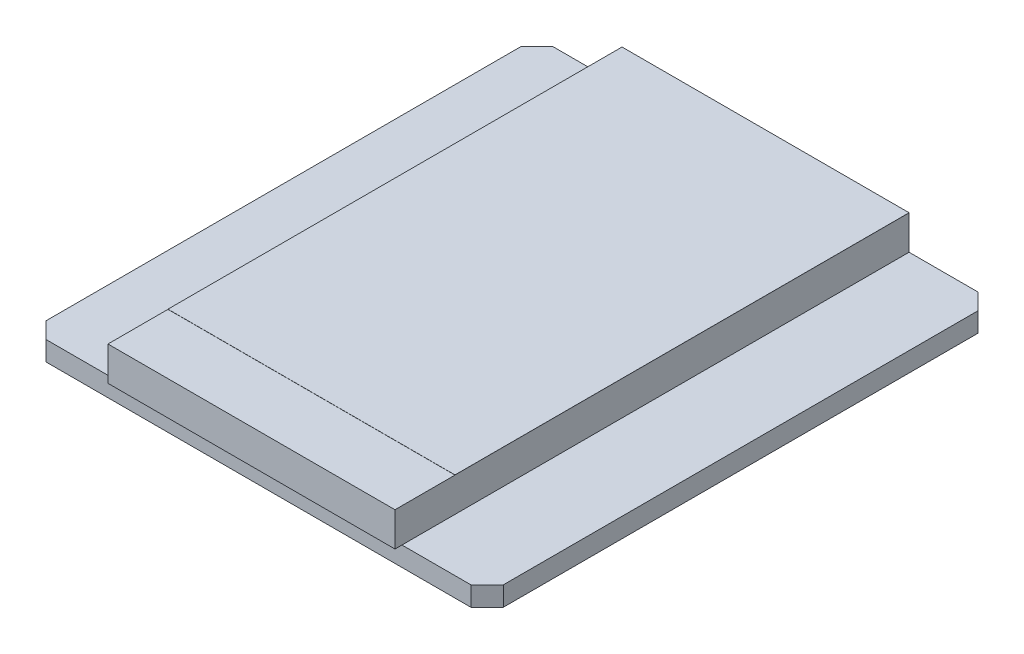
ISO-10303-21;
HEADER;
FILE_DESCRIPTION(('STEP AP214'),'2;1');
FILE_NAME('part.step','',(''),(''),'','','');
FILE_SCHEMA(('AUTOMOTIVE_DESIGN { 1 0 10303 214 1 1 1 1 }'));
ENDSEC;
DATA;
#1=APPLICATION_CONTEXT('core data for automotive mechanical design processes');
#2=APPLICATION_PROTOCOL_DEFINITION('international standard','automotive_design',2000,#1);
#3=PRODUCT_CONTEXT('',#1,'mechanical');
#4=PRODUCT('Part','Part','',(#3));
#5=PRODUCT_RELATED_PRODUCT_CATEGORY('part','',(#4));
#6=PRODUCT_DEFINITION_FORMATION('','',#4);
#7=PRODUCT_DEFINITION_CONTEXT('part definition',#1,'design');
#8=PRODUCT_DEFINITION('design','',#6,#7);
#9=PRODUCT_DEFINITION_SHAPE('','',#8);
#10=(LENGTH_UNIT() NAMED_UNIT(*) SI_UNIT(.MILLI.,.METRE.));
#11=(NAMED_UNIT(*) PLANE_ANGLE_UNIT() SI_UNIT($,.RADIAN.));
#12=(NAMED_UNIT(*) SI_UNIT($,.STERADIAN.) SOLID_ANGLE_UNIT());
#13=UNCERTAINTY_MEASURE_WITH_UNIT(LENGTH_MEASURE(1.E-05),#10,'distance_accuracy_value','');
#14=(GEOMETRIC_REPRESENTATION_CONTEXT(3) GLOBAL_UNCERTAINTY_ASSIGNED_CONTEXT((#13)) GLOBAL_UNIT_ASSIGNED_CONTEXT((#10,
#11,#12)) REPRESENTATION_CONTEXT('',''));
#15=CARTESIAN_POINT('',(0.,0.,0.));
#16=DIRECTION('',(0.,0.,1.));
#17=DIRECTION('',(1.,0.,0.));
#18=AXIS2_PLACEMENT_3D('',#15,#16,#17);
#19=CARTESIAN_POINT('',(-8.85,3.31,-15.635));
#20=DIRECTION('',(1.,0.,0.));
#21=DIRECTION('',(0.,0.,-1.));
#22=AXIS2_PLACEMENT_3D('',#19,#20,#21);
#23=PLANE('',#22);
#24=DIRECTION('',(0.,0.,1.));
#25=VECTOR('',#24,1.);
#26=CARTESIAN_POINT('',(-8.85,3.3,-15.635));
#27=LINE('',#26,#25);
#28=CARTESIAN_POINT('',(-8.85,3.3,-15.635));
#29=VERTEX_POINT('',#28);
#30=CARTESIAN_POINT('',(-8.85,3.3,12.365));
#31=VERTEX_POINT('',#30);
#32=EDGE_CURVE('E120',#29,#31,#27,.T.);
#33=ORIENTED_EDGE('',*,*,#32,.T.);
#34=DIRECTION('',(0.,-1.,0.));
#35=VECTOR('',#34,1.);
#36=CARTESIAN_POINT('',(-8.85,3.31,12.365));
#37=LINE('',#36,#35);
#38=CARTESIAN_POINT('',(-8.85,3.31,12.365));
#39=VERTEX_POINT('',#38);
#40=EDGE_CURVE('E12',#39,#31,#37,.T.);
#41=ORIENTED_EDGE('',*,*,#40,.F.);
#42=DIRECTION('',(0.,0.,1.));
#43=VECTOR('',#42,1.);
#44=CARTESIAN_POINT('',(-8.85,3.31,-15.635));
#45=LINE('',#44,#43);
#46=CARTESIAN_POINT('',(-8.85,3.31,-15.635));
#47=VERTEX_POINT('',#46);
#48=EDGE_CURVE('E104',#47,#39,#45,.T.);
#49=ORIENTED_EDGE('',*,*,#48,.F.);
#50=DIRECTION('',(0.,-1.,0.));
#51=VECTOR('',#50,1.);
#52=CARTESIAN_POINT('',(-8.85,3.31,-15.635));
#53=LINE('',#52,#51);
#54=EDGE_CURVE('E114',#47,#29,#53,.T.);
#55=ORIENTED_EDGE('',*,*,#54,.T.);
#56=EDGE_LOOP('',(#33,#41,#49,#55));
#57=FACE_BOUND('',#56,.T.);
#58=ADVANCED_FACE('F53',(#57),#23,.F.);
#59=CARTESIAN_POINT('',(-8.85,3.31,12.365));
#60=DIRECTION('',(0.,0.,-1.));
#61=DIRECTION('',(-1.,0.,0.));
#62=AXIS2_PLACEMENT_3D('',#59,#60,#61);
#63=PLANE('',#62);
#64=DIRECTION('',(1.,0.,0.));
#65=VECTOR('',#64,1.);
#66=CARTESIAN_POINT('',(-8.85,3.3,12.365));
#67=LINE('',#66,#65);
#68=CARTESIAN_POINT('',(8.85,3.3,12.365));
#69=VERTEX_POINT('',#68);
#70=EDGE_CURVE('E108',#31,#69,#67,.T.);
#71=ORIENTED_EDGE('',*,*,#70,.T.);
#72=DIRECTION('',(0.,-1.,0.));
#73=VECTOR('',#72,1.);
#74=CARTESIAN_POINT('',(8.85,3.31,12.365));
#75=LINE('',#74,#73);
#76=CARTESIAN_POINT('',(8.85,3.31,12.365));
#77=VERTEX_POINT('',#76);
#78=EDGE_CURVE('E65',#77,#69,#75,.T.);
#79=ORIENTED_EDGE('',*,*,#78,.F.);
#80=DIRECTION('',(1.,0.,0.));
#81=VECTOR('',#80,1.);
#82=CARTESIAN_POINT('',(-8.85,3.31,12.365));
#83=LINE('',#82,#81);
#84=EDGE_CURVE('E99',#39,#77,#83,.T.);
#85=ORIENTED_EDGE('',*,*,#84,.F.);
#86=ORIENTED_EDGE('',*,*,#40,.T.);
#87=EDGE_LOOP('',(#71,#79,#85,#86));
#88=FACE_BOUND('',#87,.T.);
#89=ADVANCED_FACE('F107',(#88),#63,.F.);
#90=CARTESIAN_POINT('',(8.85,3.31,-15.635));
#91=DIRECTION('',(-1.,0.,0.));
#92=DIRECTION('',(0.,0.,1.));
#93=AXIS2_PLACEMENT_3D('',#90,#91,#92);
#94=PLANE('',#93);
#95=DIRECTION('',(0.,0.,-1.));
#96=VECTOR('',#95,1.);
#97=CARTESIAN_POINT('',(8.85,3.3,-15.635));
#98=LINE('',#97,#96);
#99=CARTESIAN_POINT('',(8.85,3.3,-15.635));
#100=VERTEX_POINT('',#99);
#101=EDGE_CURVE('E87',#69,#100,#98,.T.);
#102=ORIENTED_EDGE('',*,*,#101,.T.);
#103=DIRECTION('',(0.,-1.,0.));
#104=VECTOR('',#103,1.);
#105=CARTESIAN_POINT('',(8.85,3.31,-15.635));
#106=LINE('',#105,#104);
#107=CARTESIAN_POINT('',(8.85,3.31,-15.635));
#108=VERTEX_POINT('',#107);
#109=EDGE_CURVE('E109',#108,#100,#106,.T.);
#110=ORIENTED_EDGE('',*,*,#109,.F.);
#111=DIRECTION('',(0.,0.,-1.));
#112=VECTOR('',#111,1.);
#113=CARTESIAN_POINT('',(8.85,3.31,-15.635));
#114=LINE('',#113,#112);
#115=EDGE_CURVE('E103',#77,#108,#114,.T.);
#116=ORIENTED_EDGE('',*,*,#115,.F.);
#117=ORIENTED_EDGE('',*,*,#78,.T.);
#118=EDGE_LOOP('',(#102,#110,#116,#117));
#119=FACE_BOUND('',#118,.T.);
#120=ADVANCED_FACE('F112',(#119),#94,.F.);
#121=CARTESIAN_POINT('',(-8.85,3.31,-15.635));
#122=DIRECTION('',(0.,0.,1.));
#123=DIRECTION('',(1.,0.,0.));
#124=AXIS2_PLACEMENT_3D('',#121,#122,#123);
#125=PLANE('',#124);
#126=DIRECTION('',(-1.,0.,0.));
#127=VECTOR('',#126,1.);
#128=CARTESIAN_POINT('',(-8.85,3.3,-15.635));
#129=LINE('',#128,#127);
#130=EDGE_CURVE('E91',#100,#29,#129,.T.);
#131=ORIENTED_EDGE('',*,*,#130,.T.);
#132=ORIENTED_EDGE('',*,*,#54,.F.);
#133=DIRECTION('',(-1.,0.,0.));
#134=VECTOR('',#133,1.);
#135=CARTESIAN_POINT('',(-8.85,3.31,-15.635));
#136=LINE('',#135,#134);
#137=EDGE_CURVE('E67',#108,#47,#136,.T.);
#138=ORIENTED_EDGE('',*,*,#137,.F.);
#139=ORIENTED_EDGE('',*,*,#109,.T.);
#140=EDGE_LOOP('',(#131,#132,#138,#139));
#141=FACE_BOUND('',#140,.T.);
#142=ADVANCED_FACE('F123',(#141),#125,.F.);
#143=CARTESIAN_POINT('',(0.,3.31,0.));
#144=DIRECTION('',(0.,1.,0.));
#145=DIRECTION('',(0.,0.,1.));
#146=AXIS2_PLACEMENT_3D('',#143,#144,#145);
#147=PLANE('',#146);
#148=ORIENTED_EDGE('',*,*,#48,.T.);
#149=ORIENTED_EDGE('',*,*,#84,.T.);
#150=ORIENTED_EDGE('',*,*,#115,.T.);
#151=ORIENTED_EDGE('',*,*,#137,.T.);
#152=EDGE_LOOP('',(#148,#149,#150,#151));
#153=FACE_BOUND('',#152,.T.);
#154=ADVANCED_FACE('F101',(#153),#147,.T.);
#155=CARTESIAN_POINT('',(0.,3.3,0.));
#156=DIRECTION('',(0.,1.,0.));
#157=DIRECTION('',(0.,0.,1.));
#158=AXIS2_PLACEMENT_3D('',#155,#156,#157);
#159=PLANE('',#158);
#160=ORIENTED_EDGE('',*,*,#32,.F.);
#161=ORIENTED_EDGE('',*,*,#130,.F.);
#162=ORIENTED_EDGE('',*,*,#101,.F.);
#163=ORIENTED_EDGE('',*,*,#70,.F.);
#164=EDGE_LOOP('',(#160,#161,#162,#163));
#165=FACE_BOUND('',#164,.T.);
#166=ADVANCED_FACE('F130',(#165),#159,.F.);
#167=CLOSED_SHELL('',(#58,#89,#120,#142,#154,#166));
#168=MANIFOLD_SOLID_BREP('B2',#167);
#169=CARTESIAN_POINT('',(-8.85,3.3,-15.635));
#170=DIRECTION('',(0.,0.,-1.));
#171=DIRECTION('',(-1.,0.,0.));
#172=AXIS2_PLACEMENT_3D('',#169,#170,#171);
#173=PLANE('',#172);
#174=DIRECTION('',(1.,0.,0.));
#175=VECTOR('',#174,1.);
#176=CARTESIAN_POINT('',(-8.85,1.2,-15.635));
#177=LINE('',#176,#175);
#178=CARTESIAN_POINT('',(-8.85,1.2,-15.635));
#179=VERTEX_POINT('',#178);
#180=CARTESIAN_POINT('',(8.85,1.2,-15.635));
#181=VERTEX_POINT('',#180);
#182=EDGE_CURVE('E262',#179,#181,#177,.T.);
#183=ORIENTED_EDGE('',*,*,#182,.F.);
#184=DIRECTION('',(0.,-1.,0.));
#185=VECTOR('',#184,1.);
#186=CARTESIAN_POINT('',(-8.85,3.3,-15.635));
#187=LINE('',#186,#185);
#188=CARTESIAN_POINT('',(-8.85,3.3,-15.635));
#189=VERTEX_POINT('',#188);
#190=EDGE_CURVE('E55',#189,#179,#187,.T.);
#191=ORIENTED_EDGE('',*,*,#190,.F.);
#192=DIRECTION('',(1.,0.,0.));
#193=VECTOR('',#192,1.);
#194=CARTESIAN_POINT('',(-8.85,3.3,-15.635));
#195=LINE('',#194,#193);
#196=CARTESIAN_POINT('',(8.85,3.3,-15.635));
#197=VERTEX_POINT('',#196);
#198=EDGE_CURVE('E259',#189,#197,#195,.T.);
#199=ORIENTED_EDGE('',*,*,#198,.T.);
#200=DIRECTION('',(0.,-1.,0.));
#201=VECTOR('',#200,1.);
#202=CARTESIAN_POINT('',(8.85,3.3,-15.635));
#203=LINE('',#202,#201);
#204=EDGE_CURVE('E205',#197,#181,#203,.T.);
#205=ORIENTED_EDGE('',*,*,#204,.T.);
#206=EDGE_LOOP('',(#183,#191,#199,#205));
#207=FACE_BOUND('',#206,.T.);
#208=ADVANCED_FACE('F200',(#207),#173,.T.);
#209=CARTESIAN_POINT('',(-8.85,3.3,-15.635));
#210=DIRECTION('',(1.,0.,0.));
#211=DIRECTION('',(0.,0.,-1.));
#212=AXIS2_PLACEMENT_3D('',#209,#210,#211);
#213=PLANE('',#212);
#214=DIRECTION('',(0.,0.,1.));
#215=VECTOR('',#214,1.);
#216=CARTESIAN_POINT('',(-8.85,1.2,-15.635));
#217=LINE('',#216,#215);
#218=CARTESIAN_POINT('',(-8.85,1.2,16.065));
#219=VERTEX_POINT('',#218);
#220=EDGE_CURVE('E231',#179,#219,#217,.T.);
#221=ORIENTED_EDGE('',*,*,#220,.T.);
#222=DIRECTION('',(0.,-1.,0.));
#223=VECTOR('',#222,1.);
#224=CARTESIAN_POINT('',(-8.85,3.3,16.065));
#225=LINE('',#224,#223);
#226=CARTESIAN_POINT('',(-8.85,3.3,16.065));
#227=VERTEX_POINT('',#226);
#228=EDGE_CURVE('E208',#227,#219,#225,.T.);
#229=ORIENTED_EDGE('',*,*,#228,.F.);
#230=DIRECTION('',(0.,0.,1.));
#231=VECTOR('',#230,1.);
#232=CARTESIAN_POINT('',(-8.85,3.3,-15.635));
#233=LINE('',#232,#231);
#234=EDGE_CURVE('E248',#189,#227,#233,.T.);
#235=ORIENTED_EDGE('',*,*,#234,.F.);
#236=ORIENTED_EDGE('',*,*,#190,.T.);
#237=EDGE_LOOP('',(#221,#229,#235,#236));
#238=FACE_BOUND('',#237,.T.);
#239=ADVANCED_FACE('F273',(#238),#213,.F.);
#240=CARTESIAN_POINT('',(-8.85,3.3,16.065));
#241=DIRECTION('',(0.,0.,-1.));
#242=DIRECTION('',(-1.,0.,0.));
#243=AXIS2_PLACEMENT_3D('',#240,#241,#242);
#244=PLANE('',#243);
#245=DIRECTION('',(1.,0.,0.));
#246=VECTOR('',#245,1.);
#247=CARTESIAN_POINT('',(-8.85,1.2,16.065));
#248=LINE('',#247,#246);
#249=CARTESIAN_POINT('',(8.85,1.2,16.065));
#250=VERTEX_POINT('',#249);
#251=EDGE_CURVE('E258',#219,#250,#248,.T.);
#252=ORIENTED_EDGE('',*,*,#251,.T.);
#253=DIRECTION('',(0.,-1.,0.));
#254=VECTOR('',#253,1.);
#255=CARTESIAN_POINT('',(8.85,3.3,16.065));
#256=LINE('',#255,#254);
#257=CARTESIAN_POINT('',(8.85,3.3,16.065));
#258=VERTEX_POINT('',#257);
#259=EDGE_CURVE('E251',#258,#250,#256,.T.);
#260=ORIENTED_EDGE('',*,*,#259,.F.);
#261=DIRECTION('',(1.,0.,0.));
#262=VECTOR('',#261,1.);
#263=CARTESIAN_POINT('',(-8.85,3.3,16.065));
#264=LINE('',#263,#262);
#265=EDGE_CURVE('E242',#227,#258,#264,.T.);
#266=ORIENTED_EDGE('',*,*,#265,.F.);
#267=ORIENTED_EDGE('',*,*,#228,.T.);
#268=EDGE_LOOP('',(#252,#260,#266,#267));
#269=FACE_BOUND('',#268,.T.);
#270=ADVANCED_FACE('F255',(#269),#244,.F.);
#271=CARTESIAN_POINT('',(8.85,3.3,-15.635));
#272=DIRECTION('',(1.,0.,0.));
#273=DIRECTION('',(0.,0.,-1.));
#274=AXIS2_PLACEMENT_3D('',#271,#272,#273);
#275=PLANE('',#274);
#276=DIRECTION('',(0.,0.,1.));
#277=VECTOR('',#276,1.);
#278=CARTESIAN_POINT('',(8.85,1.2,-15.635));
#279=LINE('',#278,#277);
#280=EDGE_CURVE('E270',#181,#250,#279,.T.);
#281=ORIENTED_EDGE('',*,*,#280,.F.);
#282=ORIENTED_EDGE('',*,*,#204,.F.);
#283=DIRECTION('',(0.,0.,1.));
#284=VECTOR('',#283,1.);
#285=CARTESIAN_POINT('',(8.85,3.3,-15.635));
#286=LINE('',#285,#284);
#287=EDGE_CURVE('E250',#197,#258,#286,.T.);
#288=ORIENTED_EDGE('',*,*,#287,.T.);
#289=ORIENTED_EDGE('',*,*,#259,.T.);
#290=EDGE_LOOP('',(#281,#282,#288,#289));
#291=FACE_BOUND('',#290,.T.);
#292=ADVANCED_FACE('F256',(#291),#275,.T.);
#293=CARTESIAN_POINT('',(0.,3.3,0.));
#294=DIRECTION('',(0.,-1.,0.));
#295=DIRECTION('',(0.,0.,-1.));
#296=AXIS2_PLACEMENT_3D('',#293,#294,#295);
#297=PLANE('',#296);
#298=ORIENTED_EDGE('',*,*,#198,.F.);
#299=ORIENTED_EDGE('',*,*,#234,.T.);
#300=ORIENTED_EDGE('',*,*,#265,.T.);
#301=ORIENTED_EDGE('',*,*,#287,.F.);
#302=EDGE_LOOP('',(#298,#299,#300,#301));
#303=FACE_BOUND('',#302,.T.);
#304=ADVANCED_FACE('F246',(#303),#297,.F.);
#305=CARTESIAN_POINT('',(0.,1.2,0.));
#306=DIRECTION('',(0.,-1.,0.));
#307=DIRECTION('',(0.,0.,-1.));
#308=AXIS2_PLACEMENT_3D('',#305,#306,#307);
#309=PLANE('',#308);
#310=ORIENTED_EDGE('',*,*,#182,.T.);
#311=ORIENTED_EDGE('',*,*,#280,.T.);
#312=ORIENTED_EDGE('',*,*,#251,.F.);
#313=ORIENTED_EDGE('',*,*,#220,.F.);
#314=EDGE_LOOP('',(#310,#311,#312,#313));
#315=FACE_BOUND('',#314,.T.);
#316=ADVANCED_FACE('F275',(#315),#309,.T.);
#317=CLOSED_SHELL('',(#208,#239,#270,#292,#304,#316));
#318=MANIFOLD_SOLID_BREP('B6',#317);
#319=CARTESIAN_POINT('',(-13.1,1.2,-15.635));
#320=DIRECTION('',(0.,0.,1.));
#321=DIRECTION('',(1.,0.,0.));
#322=AXIS2_PLACEMENT_3D('',#319,#320,#321);
#323=PLANE('',#322);
#324=DIRECTION('',(-1.,0.,0.));
#325=VECTOR('',#324,1.);
#326=CARTESIAN_POINT('',(-13.1,0.,-15.635));
#327=LINE('',#326,#325);
#328=CARTESIAN_POINT('',(13.1,0.,-15.635));
#329=VERTEX_POINT('',#328);
#330=CARTESIAN_POINT('',(-13.1,0.,-15.635));
#331=VERTEX_POINT('',#330);
#332=EDGE_CURVE('E431',#329,#331,#327,.T.);
#333=ORIENTED_EDGE('',*,*,#332,.T.);
#334=DIRECTION('',(0.,-1.,0.));
#335=VECTOR('',#334,1.);
#336=CARTESIAN_POINT('',(-13.1,1.2,-15.635));
#337=LINE('',#336,#335);
#338=CARTESIAN_POINT('',(-13.1,1.2,-15.635));
#339=VERTEX_POINT('',#338);
#340=EDGE_CURVE('E197',#339,#331,#337,.T.);
#341=ORIENTED_EDGE('',*,*,#340,.F.);
#342=DIRECTION('',(-1.,0.,0.));
#343=VECTOR('',#342,1.);
#344=CARTESIAN_POINT('',(-13.1,1.2,-15.635));
#345=LINE('',#344,#343);
#346=CARTESIAN_POINT('',(13.1,1.2,-15.635));
#347=VERTEX_POINT('',#346);
#348=EDGE_CURVE('E443',#347,#339,#345,.T.);
#349=ORIENTED_EDGE('',*,*,#348,.F.);
#350=DIRECTION('',(0.,-1.,0.));
#351=VECTOR('',#350,1.);
#352=CARTESIAN_POINT('',(13.1,1.2,-15.635));
#353=LINE('',#352,#351);
#354=EDGE_CURVE('E430',#347,#329,#353,.T.);
#355=ORIENTED_EDGE('',*,*,#354,.T.);
#356=EDGE_LOOP('',(#333,#341,#349,#355));
#357=FACE_BOUND('',#356,.T.);
#358=ADVANCED_FACE('F333',(#357),#323,.F.);
#359=CARTESIAN_POINT('',(-14.1,1.2,-14.635));
#360=DIRECTION('',(0.707106781186547,0.,0.707106781186547));
#361=DIRECTION('',(0.707106781186548,0.,-0.707106781186548));
#362=AXIS2_PLACEMENT_3D('',#359,#360,#361);
#363=PLANE('',#362);
#364=DIRECTION('',(-0.707106781186547,0.,0.707106781186547));
#365=VECTOR('',#364,1.);
#366=CARTESIAN_POINT('',(-14.1,0.,-14.635));
#367=LINE('',#366,#365);
#368=CARTESIAN_POINT('',(-14.1,0.,-14.635));
#369=VERTEX_POINT('',#368);
#370=EDGE_CURVE('E432',#331,#369,#367,.T.);
#371=ORIENTED_EDGE('',*,*,#370,.T.);
#372=DIRECTION('',(0.,-1.,0.));
#373=VECTOR('',#372,1.);
#374=CARTESIAN_POINT('',(-14.1,1.2,-14.635));
#375=LINE('',#374,#373);
#376=CARTESIAN_POINT('',(-14.1,1.2,-14.635));
#377=VERTEX_POINT('',#376);
#378=EDGE_CURVE('E345',#377,#369,#375,.T.);
#379=ORIENTED_EDGE('',*,*,#378,.F.);
#380=DIRECTION('',(-0.707106781186547,0.,0.707106781186547));
#381=VECTOR('',#380,1.);
#382=CARTESIAN_POINT('',(-14.1,1.2,-14.635));
#383=LINE('',#382,#381);
#384=EDGE_CURVE('E392',#339,#377,#383,.T.);
#385=ORIENTED_EDGE('',*,*,#384,.F.);
#386=ORIENTED_EDGE('',*,*,#340,.T.);
#387=EDGE_LOOP('',(#371,#379,#385,#386));
#388=FACE_BOUND('',#387,.T.);
#389=ADVANCED_FACE('F477',(#388),#363,.F.);
#390=CARTESIAN_POINT('',(-14.1,1.2,-14.635));
#391=DIRECTION('',(1.,0.,0.));
#392=DIRECTION('',(0.,0.,-1.));
#393=AXIS2_PLACEMENT_3D('',#390,#391,#392);
#394=PLANE('',#393);
#395=DIRECTION('',(0.,0.,1.));
#396=VECTOR('',#395,1.);
#397=CARTESIAN_POINT('',(-14.1,0.,-14.635));
#398=LINE('',#397,#396);
#399=CARTESIAN_POINT('',(-14.1,0.,14.635));
#400=VERTEX_POINT('',#399);
#401=EDGE_CURVE('E436',#369,#400,#398,.T.);
#402=ORIENTED_EDGE('',*,*,#401,.T.);
#403=DIRECTION('',(0.,-1.,0.));
#404=VECTOR('',#403,1.);
#405=CARTESIAN_POINT('',(-14.1,1.2,14.635));
#406=LINE('',#405,#404);
#407=CARTESIAN_POINT('',(-14.1,1.2,14.635));
#408=VERTEX_POINT('',#407);
#409=EDGE_CURVE('E451',#408,#400,#406,.T.);
#410=ORIENTED_EDGE('',*,*,#409,.F.);
#411=DIRECTION('',(0.,0.,1.));
#412=VECTOR('',#411,1.);
#413=CARTESIAN_POINT('',(-14.1,1.2,-14.635));
#414=LINE('',#413,#412);
#415=EDGE_CURVE('E458',#377,#408,#414,.T.);
#416=ORIENTED_EDGE('',*,*,#415,.F.);
#417=ORIENTED_EDGE('',*,*,#378,.T.);
#418=EDGE_LOOP('',(#402,#410,#416,#417));
#419=FACE_BOUND('',#418,.T.);
#420=ADVANCED_FACE('F456',(#419),#394,.F.);
#421=CARTESIAN_POINT('',(-14.1,1.2,14.635));
#422=DIRECTION('',(0.707106781186547,0.,-0.707106781186547));
#423=DIRECTION('',(-0.707106781186548,0.,-0.707106781186548));
#424=AXIS2_PLACEMENT_3D('',#421,#422,#423);
#425=PLANE('',#424);
#426=DIRECTION('',(0.707106781186547,0.,0.707106781186547));
#427=VECTOR('',#426,1.);
#428=CARTESIAN_POINT('',(-14.1,0.,14.635));
#429=LINE('',#428,#427);
#430=CARTESIAN_POINT('',(-13.1,0.,15.635));
#431=VERTEX_POINT('',#430);
#432=EDGE_CURVE('E437',#400,#431,#429,.T.);
#433=ORIENTED_EDGE('',*,*,#432,.T.);
#434=DIRECTION('',(0.,-1.,0.));
#435=VECTOR('',#434,1.);
#436=CARTESIAN_POINT('',(-13.1,1.2,15.635));
#437=LINE('',#436,#435);
#438=CARTESIAN_POINT('',(-13.1,1.2,15.635));
#439=VERTEX_POINT('',#438);
#440=EDGE_CURVE('E447',#439,#431,#437,.T.);
#441=ORIENTED_EDGE('',*,*,#440,.F.);
#442=DIRECTION('',(0.707106781186547,0.,0.707106781186547));
#443=VECTOR('',#442,1.);
#444=CARTESIAN_POINT('',(-14.1,1.2,14.635));
#445=LINE('',#444,#443);
#446=EDGE_CURVE('E472',#408,#439,#445,.T.);
#447=ORIENTED_EDGE('',*,*,#446,.F.);
#448=ORIENTED_EDGE('',*,*,#409,.T.);
#449=EDGE_LOOP('',(#433,#441,#447,#448));
#450=FACE_BOUND('',#449,.T.);
#451=ADVANCED_FACE('F470',(#450),#425,.F.);
#452=CARTESIAN_POINT('',(-13.1,1.2,15.635));
#453=DIRECTION('',(0.,0.,-1.));
#454=DIRECTION('',(-1.,0.,0.));
#455=AXIS2_PLACEMENT_3D('',#452,#453,#454);
#456=PLANE('',#455);
#457=DIRECTION('',(1.,0.,0.));
#458=VECTOR('',#457,1.);
#459=CARTESIAN_POINT('',(-13.1,0.,15.635));
#460=LINE('',#459,#458);
#461=CARTESIAN_POINT('',(13.1,0.,15.635));
#462=VERTEX_POINT('',#461);
#463=EDGE_CURVE('E439',#431,#462,#460,.T.);
#464=ORIENTED_EDGE('',*,*,#463,.T.);
#465=DIRECTION('',(0.,-1.,0.));
#466=VECTOR('',#465,1.);
#467=CARTESIAN_POINT('',(13.1,1.2,15.635));
#468=LINE('',#467,#466);
#469=CARTESIAN_POINT('',(13.1,1.2,15.635));
#470=VERTEX_POINT('',#469);
#471=EDGE_CURVE('E425',#470,#462,#468,.T.);
#472=ORIENTED_EDGE('',*,*,#471,.F.);
#473=DIRECTION('',(1.,0.,0.));
#474=VECTOR('',#473,1.);
#475=CARTESIAN_POINT('',(-13.1,1.2,15.635));
#476=LINE('',#475,#474);
#477=EDGE_CURVE('E415',#439,#470,#476,.T.);
#478=ORIENTED_EDGE('',*,*,#477,.F.);
#479=ORIENTED_EDGE('',*,*,#440,.T.);
#480=EDGE_LOOP('',(#464,#472,#478,#479));
#481=FACE_BOUND('',#480,.T.);
#482=ADVANCED_FACE('F473',(#481),#456,.F.);
#483=CARTESIAN_POINT('',(14.1,1.2,14.635));
#484=DIRECTION('',(-0.707106781186547,0.,-0.707106781186547));
#485=DIRECTION('',(-0.707106781186548,0.,0.707106781186548));
#486=AXIS2_PLACEMENT_3D('',#483,#484,#485);
#487=PLANE('',#486);
#488=DIRECTION('',(0.707106781186547,0.,-0.707106781186547));
#489=VECTOR('',#488,1.);
#490=CARTESIAN_POINT('',(14.1,0.,14.635));
#491=LINE('',#490,#489);
#492=CARTESIAN_POINT('',(14.1,0.,14.635));
#493=VERTEX_POINT('',#492);
#494=EDGE_CURVE('E423',#462,#493,#491,.T.);
#495=ORIENTED_EDGE('',*,*,#494,.T.);
#496=DIRECTION('',(0.,-1.,0.));
#497=VECTOR('',#496,1.);
#498=CARTESIAN_POINT('',(14.1,1.2,14.635));
#499=LINE('',#498,#497);
#500=CARTESIAN_POINT('',(14.1,1.2,14.635));
#501=VERTEX_POINT('',#500);
#502=EDGE_CURVE('E416',#501,#493,#499,.T.);
#503=ORIENTED_EDGE('',*,*,#502,.F.);
#504=DIRECTION('',(0.707106781186547,0.,-0.707106781186547));
#505=VECTOR('',#504,1.);
#506=CARTESIAN_POINT('',(14.1,1.2,14.635));
#507=LINE('',#506,#505);
#508=EDGE_CURVE('E410',#470,#501,#507,.T.);
#509=ORIENTED_EDGE('',*,*,#508,.F.);
#510=ORIENTED_EDGE('',*,*,#471,.T.);
#511=EDGE_LOOP('',(#495,#503,#509,#510));
#512=FACE_BOUND('',#511,.T.);
#513=ADVANCED_FACE('F420',(#512),#487,.F.);
#514=CARTESIAN_POINT('',(14.1,1.2,-14.635));
#515=DIRECTION('',(-1.,0.,0.));
#516=DIRECTION('',(0.,0.,1.));
#517=AXIS2_PLACEMENT_3D('',#514,#515,#516);
#518=PLANE('',#517);
#519=DIRECTION('',(0.,0.,-1.));
#520=VECTOR('',#519,1.);
#521=CARTESIAN_POINT('',(14.1,0.,-14.635));
#522=LINE('',#521,#520);
#523=CARTESIAN_POINT('',(14.1,0.,-14.635));
#524=VERTEX_POINT('',#523);
#525=EDGE_CURVE('E379',#493,#524,#522,.T.);
#526=ORIENTED_EDGE('',*,*,#525,.T.);
#527=DIRECTION('',(0.,-1.,0.));
#528=VECTOR('',#527,1.);
#529=CARTESIAN_POINT('',(14.1,1.2,-14.635));
#530=LINE('',#529,#528);
#531=CARTESIAN_POINT('',(14.1,1.2,-14.635));
#532=VERTEX_POINT('',#531);
#533=EDGE_CURVE('E421',#532,#524,#530,.T.);
#534=ORIENTED_EDGE('',*,*,#533,.F.);
#535=DIRECTION('',(0.,0.,-1.));
#536=VECTOR('',#535,1.);
#537=CARTESIAN_POINT('',(14.1,1.2,-14.635));
#538=LINE('',#537,#536);
#539=EDGE_CURVE('E414',#501,#532,#538,.T.);
#540=ORIENTED_EDGE('',*,*,#539,.F.);
#541=ORIENTED_EDGE('',*,*,#502,.T.);
#542=EDGE_LOOP('',(#526,#534,#540,#541));
#543=FACE_BOUND('',#542,.T.);
#544=ADVANCED_FACE('F422',(#543),#518,.F.);
#545=CARTESIAN_POINT('',(13.1,1.2,-15.635));
#546=DIRECTION('',(-0.707106781186547,0.,0.707106781186547));
#547=DIRECTION('',(0.707106781186548,0.,0.707106781186548));
#548=AXIS2_PLACEMENT_3D('',#545,#546,#547);
#549=PLANE('',#548);
#550=DIRECTION('',(-0.707106781186547,0.,-0.707106781186547));
#551=VECTOR('',#550,1.);
#552=CARTESIAN_POINT('',(13.1,0.,-15.635));
#553=LINE('',#552,#551);
#554=EDGE_CURVE('E387',#524,#329,#553,.T.);
#555=ORIENTED_EDGE('',*,*,#554,.T.);
#556=ORIENTED_EDGE('',*,*,#354,.F.);
#557=DIRECTION('',(-0.707106781186547,0.,-0.707106781186547));
#558=VECTOR('',#557,1.);
#559=CARTESIAN_POINT('',(13.1,1.2,-15.635));
#560=LINE('',#559,#558);
#561=EDGE_CURVE('E353',#532,#347,#560,.T.);
#562=ORIENTED_EDGE('',*,*,#561,.F.);
#563=ORIENTED_EDGE('',*,*,#533,.T.);
#564=EDGE_LOOP('',(#555,#556,#562,#563));
#565=FACE_BOUND('',#564,.T.);
#566=ADVANCED_FACE('F497',(#565),#549,.F.);
#567=CARTESIAN_POINT('',(0.,1.2,0.));
#568=DIRECTION('',(0.,-1.,0.));
#569=DIRECTION('',(0.,0.,-1.));
#570=AXIS2_PLACEMENT_3D('',#567,#568,#569);
#571=PLANE('',#570);
#572=ORIENTED_EDGE('',*,*,#348,.T.);
#573=ORIENTED_EDGE('',*,*,#384,.T.);
#574=ORIENTED_EDGE('',*,*,#415,.T.);
#575=ORIENTED_EDGE('',*,*,#446,.T.);
#576=ORIENTED_EDGE('',*,*,#477,.T.);
#577=ORIENTED_EDGE('',*,*,#508,.T.);
#578=ORIENTED_EDGE('',*,*,#539,.T.);
#579=ORIENTED_EDGE('',*,*,#561,.T.);
#580=EDGE_LOOP('',(#572,#573,#574,#575,#576,#577,#578,#579));
#581=FACE_BOUND('',#580,.T.);
#582=ADVANCED_FACE('F407',(#581),#571,.F.);
#583=CARTESIAN_POINT('',(0.,0.,0.));
#584=DIRECTION('',(0.,-1.,0.));
#585=DIRECTION('',(0.,0.,-1.));
#586=AXIS2_PLACEMENT_3D('',#583,#584,#585);
#587=PLANE('',#586);
#588=ORIENTED_EDGE('',*,*,#332,.F.);
#589=ORIENTED_EDGE('',*,*,#554,.F.);
#590=ORIENTED_EDGE('',*,*,#525,.F.);
#591=ORIENTED_EDGE('',*,*,#494,.F.);
#592=ORIENTED_EDGE('',*,*,#463,.F.);
#593=ORIENTED_EDGE('',*,*,#432,.F.);
#594=ORIENTED_EDGE('',*,*,#401,.F.);
#595=ORIENTED_EDGE('',*,*,#370,.F.);
#596=EDGE_LOOP('',(#588,#589,#590,#591,#592,#593,#594,#595));
#597=FACE_BOUND('',#596,.T.);
#598=ADVANCED_FACE('F462',(#597),#587,.T.);
#599=CLOSED_SHELL('',(#358,#389,#420,#451,#482,#513,#544,#566,#582,#598));
#600=MANIFOLD_SOLID_BREP('B46',#599);
#601=ADVANCED_BREP_SHAPE_REPRESENTATION('',(#18,#168,#318,#600),#14);
#602=SHAPE_DEFINITION_REPRESENTATION(#9,#601);
ENDSEC;
END-ISO-10303-21;
